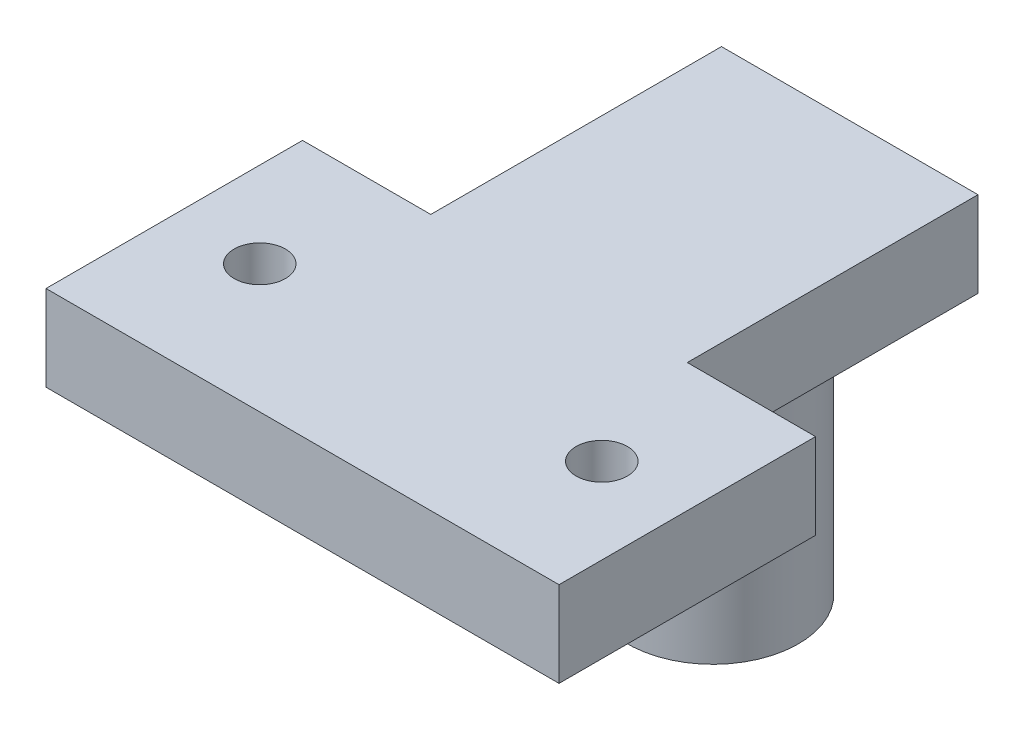
ISO-10303-21;
HEADER;
FILE_DESCRIPTION(('STEP AP214'),'2;1');
FILE_NAME('part.step','',(''),(''),'','','');
FILE_SCHEMA(('AUTOMOTIVE_DESIGN { 1 0 10303 214 1 1 1 1 }'));
ENDSEC;
DATA;
#1=APPLICATION_CONTEXT('core data for automotive mechanical design processes');
#2=APPLICATION_PROTOCOL_DEFINITION('international standard','automotive_design',2000,#1);
#3=PRODUCT_CONTEXT('',#1,'mechanical');
#4=PRODUCT('Part','Part','',(#3));
#5=PRODUCT_RELATED_PRODUCT_CATEGORY('part','',(#4));
#6=PRODUCT_DEFINITION_FORMATION('','',#4);
#7=PRODUCT_DEFINITION_CONTEXT('part definition',#1,'design');
#8=PRODUCT_DEFINITION('design','',#6,#7);
#9=PRODUCT_DEFINITION_SHAPE('','',#8);
#10=(LENGTH_UNIT() NAMED_UNIT(*) SI_UNIT(.MILLI.,.METRE.));
#11=(NAMED_UNIT(*) PLANE_ANGLE_UNIT() SI_UNIT($,.RADIAN.));
#12=(NAMED_UNIT(*) SI_UNIT($,.STERADIAN.) SOLID_ANGLE_UNIT());
#13=UNCERTAINTY_MEASURE_WITH_UNIT(LENGTH_MEASURE(1.E-05),#10,'distance_accuracy_value','');
#14=(GEOMETRIC_REPRESENTATION_CONTEXT(3) GLOBAL_UNCERTAINTY_ASSIGNED_CONTEXT((#13)) GLOBAL_UNIT_ASSIGNED_CONTEXT((#10,
#11,#12)) REPRESENTATION_CONTEXT('',''));
#15=CARTESIAN_POINT('',(0.,0.,0.));
#16=DIRECTION('',(0.,0.,1.));
#17=DIRECTION('',(1.,0.,0.));
#18=AXIS2_PLACEMENT_3D('',#15,#16,#17);
#19=CARTESIAN_POINT('',(0.,5.,0.));
#20=DIRECTION('',(0.,0.,1.));
#21=DIRECTION('',(1.,0.,0.));
#22=AXIS2_PLACEMENT_3D('',#19,#20,#21);
#23=PLANE('',#22);
#24=DIRECTION('',(-1.,0.,0.));
#25=VECTOR('',#24,1.);
#26=CARTESIAN_POINT('',(0.,0.,0.));
#27=LINE('',#26,#25);
#28=CARTESIAN_POINT('',(0.,0.,0.));
#29=VERTEX_POINT('',#28);
#30=CARTESIAN_POINT('',(-7.5,0.,0.));
#31=VERTEX_POINT('',#30);
#32=EDGE_CURVE('E156',#29,#31,#27,.T.);
#33=ORIENTED_EDGE('',*,*,#32,.T.);
#34=DIRECTION('',(0.,-1.,0.));
#35=VECTOR('',#34,1.);
#36=CARTESIAN_POINT('',(-7.5,5.,0.));
#37=LINE('',#36,#35);
#38=CARTESIAN_POINT('',(-7.5,5.,0.));
#39=VERTEX_POINT('',#38);
#40=EDGE_CURVE('E45',#39,#31,#37,.T.);
#41=ORIENTED_EDGE('',*,*,#40,.F.);
#42=DIRECTION('',(-1.,0.,0.));
#43=VECTOR('',#42,1.);
#44=CARTESIAN_POINT('',(0.,5.,0.));
#45=LINE('',#44,#43);
#46=CARTESIAN_POINT('',(0.,5.,0.));
#47=VERTEX_POINT('',#46);
#48=EDGE_CURVE('E250',#47,#39,#45,.T.);
#49=ORIENTED_EDGE('',*,*,#48,.F.);
#50=DIRECTION('',(0.,-1.,0.));
#51=VECTOR('',#50,1.);
#52=CARTESIAN_POINT('',(0.,5.,0.));
#53=LINE('',#52,#51);
#54=EDGE_CURVE('E60',#47,#29,#53,.T.);
#55=ORIENTED_EDGE('',*,*,#54,.T.);
#56=EDGE_LOOP('',(#33,#41,#49,#55));
#57=FACE_BOUND('',#56,.T.);
#58=ADVANCED_FACE('F41',(#57),#23,.F.);
#59=CARTESIAN_POINT('',(-7.5,5.,0.));
#60=DIRECTION('',(-1.,0.,0.));
#61=DIRECTION('',(0.,0.,1.));
#62=AXIS2_PLACEMENT_3D('',#59,#60,#61);
#63=PLANE('',#62);
#64=DIRECTION('',(0.,0.,-1.));
#65=VECTOR('',#64,1.);
#66=CARTESIAN_POINT('',(-7.5,0.,0.));
#67=LINE('',#66,#65);
#68=CARTESIAN_POINT('',(-7.5,0.,-17.));
#69=VERTEX_POINT('',#68);
#70=EDGE_CURVE('E159',#31,#69,#67,.T.);
#71=ORIENTED_EDGE('',*,*,#70,.T.);
#72=DIRECTION('',(0.,-1.,0.));
#73=VECTOR('',#72,1.);
#74=CARTESIAN_POINT('',(-7.5,5.,-17.));
#75=LINE('',#74,#73);
#76=CARTESIAN_POINT('',(-7.5,5.,-17.));
#77=VERTEX_POINT('',#76);
#78=EDGE_CURVE('E193',#77,#69,#75,.T.);
#79=ORIENTED_EDGE('',*,*,#78,.F.);
#80=DIRECTION('',(0.,0.,-1.));
#81=VECTOR('',#80,1.);
#82=CARTESIAN_POINT('',(-7.5,5.,0.));
#83=LINE('',#82,#81);
#84=EDGE_CURVE('E99',#39,#77,#83,.T.);
#85=ORIENTED_EDGE('',*,*,#84,.F.);
#86=ORIENTED_EDGE('',*,*,#40,.T.);
#87=EDGE_LOOP('',(#71,#79,#85,#86));
#88=FACE_BOUND('',#87,.T.);
#89=ADVANCED_FACE('F200',(#88),#63,.F.);
#90=CARTESIAN_POINT('',(0.,5.,-17.));
#91=DIRECTION('',(0.,0.,-1.));
#92=DIRECTION('',(-1.,0.,0.));
#93=AXIS2_PLACEMENT_3D('',#90,#91,#92);
#94=PLANE('',#93);
#95=DIRECTION('',(1.,0.,0.));
#96=VECTOR('',#95,1.);
#97=CARTESIAN_POINT('',(0.,0.,-17.));
#98=LINE('',#97,#96);
#99=CARTESIAN_POINT('',(-22.5,0.,-17.));
#100=VERTEX_POINT('',#99);
#101=EDGE_CURVE('E164',#100,#69,#98,.T.);
#102=ORIENTED_EDGE('',*,*,#101,.F.);
#103=DIRECTION('',(0.,-1.,0.));
#104=VECTOR('',#103,1.);
#105=CARTESIAN_POINT('',(-22.5,5.,-17.));
#106=LINE('',#105,#104);
#107=CARTESIAN_POINT('',(-22.5,5.,-17.));
#108=VERTEX_POINT('',#107);
#109=EDGE_CURVE('E191',#108,#100,#106,.T.);
#110=ORIENTED_EDGE('',*,*,#109,.F.);
#111=DIRECTION('',(1.,0.,0.));
#112=VECTOR('',#111,1.);
#113=CARTESIAN_POINT('',(0.,5.,-17.));
#114=LINE('',#113,#112);
#115=EDGE_CURVE('E255',#108,#77,#114,.T.);
#116=ORIENTED_EDGE('',*,*,#115,.T.);
#117=ORIENTED_EDGE('',*,*,#78,.T.);
#118=EDGE_LOOP('',(#102,#110,#116,#117));
#119=FACE_BOUND('',#118,.T.);
#120=ADVANCED_FACE('F222',(#119),#94,.T.);
#121=CARTESIAN_POINT('',(-22.5,5.,0.));
#122=DIRECTION('',(-1.,0.,0.));
#123=DIRECTION('',(0.,0.,1.));
#124=AXIS2_PLACEMENT_3D('',#121,#122,#123);
#125=PLANE('',#124);
#126=DIRECTION('',(0.,0.,-1.));
#127=VECTOR('',#126,1.);
#128=CARTESIAN_POINT('',(-22.5,0.,0.));
#129=LINE('',#128,#127);
#130=CARTESIAN_POINT('',(-22.5,0.,0.));
#131=VERTEX_POINT('',#130);
#132=EDGE_CURVE('E168',#131,#100,#129,.T.);
#133=ORIENTED_EDGE('',*,*,#132,.F.);
#134=DIRECTION('',(0.,-1.,0.));
#135=VECTOR('',#134,1.);
#136=CARTESIAN_POINT('',(-22.5,5.,0.));
#137=LINE('',#136,#135);
#138=CARTESIAN_POINT('',(-22.5,5.,0.));
#139=VERTEX_POINT('',#138);
#140=EDGE_CURVE('E188',#139,#131,#137,.T.);
#141=ORIENTED_EDGE('',*,*,#140,.F.);
#142=DIRECTION('',(0.,0.,-1.));
#143=VECTOR('',#142,1.);
#144=CARTESIAN_POINT('',(-22.5,5.,0.));
#145=LINE('',#144,#143);
#146=EDGE_CURVE('E257',#139,#108,#145,.T.);
#147=ORIENTED_EDGE('',*,*,#146,.T.);
#148=ORIENTED_EDGE('',*,*,#109,.T.);
#149=EDGE_LOOP('',(#133,#141,#147,#148));
#150=FACE_BOUND('',#149,.T.);
#151=ADVANCED_FACE('F227',(#150),#125,.T.);
#152=CARTESIAN_POINT('',(-30.,0.,0.));
#153=VERTEX_POINT('',#152);
#154=EDGE_CURVE('E160',#131,#153,#27,.T.);
#155=ORIENTED_EDGE('',*,*,#154,.T.);
#156=DIRECTION('',(0.,-1.,0.));
#157=VECTOR('',#156,1.);
#158=CARTESIAN_POINT('',(-30.,5.,0.));
#159=LINE('',#158,#157);
#160=CARTESIAN_POINT('',(-30.,5.,0.));
#161=VERTEX_POINT('',#160);
#162=EDGE_CURVE('E137',#161,#153,#159,.T.);
#163=ORIENTED_EDGE('',*,*,#162,.F.);
#164=EDGE_CURVE('E123',#139,#161,#45,.T.);
#165=ORIENTED_EDGE('',*,*,#164,.F.);
#166=ORIENTED_EDGE('',*,*,#140,.T.);
#167=EDGE_LOOP('',(#155,#163,#165,#166));
#168=FACE_BOUND('',#167,.T.);
#169=ADVANCED_FACE('F218',(#168),#23,.F.);
#170=CARTESIAN_POINT('',(-30.,5.,0.));
#171=DIRECTION('',(1.,0.,0.));
#172=DIRECTION('',(0.,0.,-1.));
#173=AXIS2_PLACEMENT_3D('',#170,#171,#172);
#174=PLANE('',#173);
#175=DIRECTION('',(0.,0.,1.));
#176=VECTOR('',#175,1.);
#177=CARTESIAN_POINT('',(-30.,0.,0.));
#178=LINE('',#177,#176);
#179=CARTESIAN_POINT('',(-30.,0.,15.));
#180=VERTEX_POINT('',#179);
#181=EDGE_CURVE('E133',#153,#180,#178,.T.);
#182=ORIENTED_EDGE('',*,*,#181,.T.);
#183=DIRECTION('',(0.,-1.,0.));
#184=VECTOR('',#183,1.);
#185=CARTESIAN_POINT('',(-30.,5.,15.));
#186=LINE('',#185,#184);
#187=CARTESIAN_POINT('',(-30.,5.,15.));
#188=VERTEX_POINT('',#187);
#189=EDGE_CURVE('E130',#188,#180,#186,.T.);
#190=ORIENTED_EDGE('',*,*,#189,.F.);
#191=DIRECTION('',(0.,0.,1.));
#192=VECTOR('',#191,1.);
#193=CARTESIAN_POINT('',(-30.,5.,0.));
#194=LINE('',#193,#192);
#195=EDGE_CURVE('E115',#161,#188,#194,.T.);
#196=ORIENTED_EDGE('',*,*,#195,.F.);
#197=ORIENTED_EDGE('',*,*,#162,.T.);
#198=EDGE_LOOP('',(#182,#190,#196,#197));
#199=FACE_BOUND('',#198,.T.);
#200=ADVANCED_FACE('F131',(#199),#174,.F.);
#201=CARTESIAN_POINT('',(0.,5.,15.));
#202=DIRECTION('',(0.,0.,1.));
#203=DIRECTION('',(1.,0.,0.));
#204=AXIS2_PLACEMENT_3D('',#201,#202,#203);
#205=PLANE('',#204);
#206=DIRECTION('',(-1.,0.,0.));
#207=VECTOR('',#206,1.);
#208=CARTESIAN_POINT('',(0.,0.,15.));
#209=LINE('',#208,#207);
#210=CARTESIAN_POINT('',(0.,0.,15.));
#211=VERTEX_POINT('',#210);
#212=EDGE_CURVE('E174',#211,#180,#209,.T.);
#213=ORIENTED_EDGE('',*,*,#212,.F.);
#214=DIRECTION('',(0.,-1.,0.));
#215=VECTOR('',#214,1.);
#216=CARTESIAN_POINT('',(0.,5.,15.));
#217=LINE('',#216,#215);
#218=CARTESIAN_POINT('',(0.,5.,15.));
#219=VERTEX_POINT('',#218);
#220=EDGE_CURVE('E86',#219,#211,#217,.T.);
#221=ORIENTED_EDGE('',*,*,#220,.F.);
#222=DIRECTION('',(-1.,0.,0.));
#223=VECTOR('',#222,1.);
#224=CARTESIAN_POINT('',(0.,5.,15.));
#225=LINE('',#224,#223);
#226=EDGE_CURVE('E120',#219,#188,#225,.T.);
#227=ORIENTED_EDGE('',*,*,#226,.T.);
#228=ORIENTED_EDGE('',*,*,#189,.T.);
#229=EDGE_LOOP('',(#213,#221,#227,#228));
#230=FACE_BOUND('',#229,.T.);
#231=ADVANCED_FACE('F139',(#230),#205,.T.);
#232=CARTESIAN_POINT('',(-25.,5.,7.5));
#233=DIRECTION('',(0.,-1.,0.));
#234=DIRECTION('',(0.,0.,-1.));
#235=AXIS2_PLACEMENT_3D('',#232,#233,#234);
#236=CYLINDRICAL_SURFACE('',#235,1.5);
#237=CARTESIAN_POINT('',(-25.,5.,7.5));
#238=DIRECTION('',(0.,1.,0.));
#239=DIRECTION('',(0.,0.,1.));
#240=AXIS2_PLACEMENT_3D('',#237,#238,#239);
#241=CIRCLE('',#240,1.5);
#242=CARTESIAN_POINT('',(-25.,5.,9.00000000000001));
#243=VERTEX_POINT('',#242);
#244=EDGE_CURVE('E246',#243,#243,#241,.T.);
#245=ORIENTED_EDGE('',*,*,#244,.T.);
#246=EDGE_LOOP('',(#245));
#247=FACE_BOUND('',#246,.T.);
#248=CARTESIAN_POINT('',(-25.,0.,7.5));
#249=DIRECTION('',(0.,1.,0.));
#250=DIRECTION('',(0.,0.,1.));
#251=AXIS2_PLACEMENT_3D('',#248,#249,#250);
#252=CIRCLE('',#251,1.5);
#253=CARTESIAN_POINT('',(-25.,0.,9.00000000000001));
#254=VERTEX_POINT('',#253);
#255=EDGE_CURVE('E151',#254,#254,#252,.T.);
#256=ORIENTED_EDGE('',*,*,#255,.F.);
#257=EDGE_LOOP('',(#256));
#258=FACE_BOUND('',#257,.T.);
#259=ADVANCED_FACE('F212',(#247,#258),#236,.F.);
#260=CARTESIAN_POINT('',(-5.,5.,7.5));
#261=DIRECTION('',(0.,-1.,0.));
#262=DIRECTION('',(0.,0.,-1.));
#263=AXIS2_PLACEMENT_3D('',#260,#261,#262);
#264=CYLINDRICAL_SURFACE('',#263,1.5);
#265=CARTESIAN_POINT('',(-5.,5.,7.5));
#266=DIRECTION('',(0.,1.,0.));
#267=DIRECTION('',(0.,0.,1.));
#268=AXIS2_PLACEMENT_3D('',#265,#266,#267);
#269=CIRCLE('',#268,1.5);
#270=CARTESIAN_POINT('',(-5.,5.,9.));
#271=VERTEX_POINT('',#270);
#272=EDGE_CURVE('E181',#271,#271,#269,.T.);
#273=ORIENTED_EDGE('',*,*,#272,.T.);
#274=EDGE_LOOP('',(#273));
#275=FACE_BOUND('',#274,.T.);
#276=CARTESIAN_POINT('',(-5.,0.,7.5));
#277=DIRECTION('',(0.,1.,0.));
#278=DIRECTION('',(0.,0.,1.));
#279=AXIS2_PLACEMENT_3D('',#276,#277,#278);
#280=CIRCLE('',#279,1.5);
#281=CARTESIAN_POINT('',(-5.,0.,9.));
#282=VERTEX_POINT('',#281);
#283=EDGE_CURVE('E147',#282,#282,#280,.T.);
#284=ORIENTED_EDGE('',*,*,#283,.F.);
#285=EDGE_LOOP('',(#284));
#286=FACE_BOUND('',#285,.T.);
#287=ADVANCED_FACE('F43',(#275,#286),#264,.F.);
#288=CARTESIAN_POINT('',(0.,5.,0.));
#289=DIRECTION('',(1.,0.,0.));
#290=DIRECTION('',(0.,0.,-1.));
#291=AXIS2_PLACEMENT_3D('',#288,#289,#290);
#292=PLANE('',#291);
#293=DIRECTION('',(0.,0.,1.));
#294=VECTOR('',#293,1.);
#295=CARTESIAN_POINT('',(0.,0.,0.));
#296=LINE('',#295,#294);
#297=EDGE_CURVE('E177',#29,#211,#296,.T.);
#298=ORIENTED_EDGE('',*,*,#297,.F.);
#299=ORIENTED_EDGE('',*,*,#54,.F.);
#300=DIRECTION('',(0.,0.,1.));
#301=VECTOR('',#300,1.);
#302=CARTESIAN_POINT('',(0.,5.,0.));
#303=LINE('',#302,#301);
#304=EDGE_CURVE('E141',#47,#219,#303,.T.);
#305=ORIENTED_EDGE('',*,*,#304,.T.);
#306=ORIENTED_EDGE('',*,*,#220,.T.);
#307=EDGE_LOOP('',(#298,#299,#305,#306));
#308=FACE_BOUND('',#307,.T.);
#309=ADVANCED_FACE('F203',(#308),#292,.T.);
#310=CARTESIAN_POINT('',(0.,5.,0.));
#311=DIRECTION('',(0.,1.,0.));
#312=DIRECTION('',(0.,0.,1.));
#313=AXIS2_PLACEMENT_3D('',#310,#311,#312);
#314=PLANE('',#313);
#315=ORIENTED_EDGE('',*,*,#272,.F.);
#316=EDGE_LOOP('',(#315));
#317=FACE_BOUND('',#316,.T.);
#318=ORIENTED_EDGE('',*,*,#244,.F.);
#319=EDGE_LOOP('',(#318));
#320=FACE_BOUND('',#319,.T.);
#321=ORIENTED_EDGE('',*,*,#48,.T.);
#322=ORIENTED_EDGE('',*,*,#84,.T.);
#323=ORIENTED_EDGE('',*,*,#115,.F.);
#324=ORIENTED_EDGE('',*,*,#146,.F.);
#325=ORIENTED_EDGE('',*,*,#164,.T.);
#326=ORIENTED_EDGE('',*,*,#195,.T.);
#327=ORIENTED_EDGE('',*,*,#226,.F.);
#328=ORIENTED_EDGE('',*,*,#304,.F.);
#329=EDGE_LOOP('',(#321,#322,#323,#324,#325,#326,#327,#328));
#330=FACE_BOUND('',#329,.T.);
#331=ADVANCED_FACE('F117',(#317,#320,#330),#314,.T.);
#332=CARTESIAN_POINT('',(0.,0.,0.));
#333=DIRECTION('',(0.,1.,0.));
#334=DIRECTION('',(0.,0.,1.));
#335=AXIS2_PLACEMENT_3D('',#332,#333,#334);
#336=PLANE('',#335);
#337=CARTESIAN_POINT('',(-15.,0.,-9.));
#338=DIRECTION('',(0.,-1.,0.));
#339=DIRECTION('',(0.,0.,-1.));
#340=AXIS2_PLACEMENT_3D('',#337,#338,#339);
#341=CIRCLE('',#340,5.);
#342=CARTESIAN_POINT('',(-15.,0.,-14.));
#343=VERTEX_POINT('',#342);
#344=EDGE_CURVE('E11',#343,#343,#341,.T.);
#345=ORIENTED_EDGE('',*,*,#344,.F.);
#346=EDGE_LOOP('',(#345));
#347=FACE_BOUND('',#346,.T.);
#348=ORIENTED_EDGE('',*,*,#283,.T.);
#349=EDGE_LOOP('',(#348));
#350=FACE_BOUND('',#349,.T.);
#351=ORIENTED_EDGE('',*,*,#255,.T.);
#352=EDGE_LOOP('',(#351));
#353=FACE_BOUND('',#352,.T.);
#354=ORIENTED_EDGE('',*,*,#32,.F.);
#355=ORIENTED_EDGE('',*,*,#297,.T.);
#356=ORIENTED_EDGE('',*,*,#212,.T.);
#357=ORIENTED_EDGE('',*,*,#181,.F.);
#358=ORIENTED_EDGE('',*,*,#154,.F.);
#359=ORIENTED_EDGE('',*,*,#132,.T.);
#360=ORIENTED_EDGE('',*,*,#101,.T.);
#361=ORIENTED_EDGE('',*,*,#70,.F.);
#362=EDGE_LOOP('',(#354,#355,#356,#357,#358,#359,#360,#361));
#363=FACE_BOUND('',#362,.T.);
#364=ADVANCED_FACE('F202',(#347,#350,#353,#363),#336,.F.);
#365=CARTESIAN_POINT('',(-15.,-15.,-9.));
#366=DIRECTION('',(0.,1.,0.));
#367=DIRECTION('',(0.,0.,1.));
#368=AXIS2_PLACEMENT_3D('',#365,#366,#367);
#369=CYLINDRICAL_SURFACE('',#368,5.);
#370=CARTESIAN_POINT('',(-15.,-15.,-9.));
#371=DIRECTION('',(0.,-1.,0.));
#372=DIRECTION('',(0.,0.,-1.));
#373=AXIS2_PLACEMENT_3D('',#370,#371,#372);
#374=CIRCLE('',#373,5.);
#375=CARTESIAN_POINT('',(-15.,-15.,-14.));
#376=VERTEX_POINT('',#375);
#377=EDGE_CURVE('E152',#376,#376,#374,.T.);
#378=ORIENTED_EDGE('',*,*,#377,.F.);
#379=EDGE_LOOP('',(#378));
#380=FACE_BOUND('',#379,.T.);
#381=ORIENTED_EDGE('',*,*,#344,.T.);
#382=EDGE_LOOP('',(#381));
#383=FACE_BOUND('',#382,.T.);
#384=ADVANCED_FACE('F276',(#380,#383),#369,.T.);
#385=CARTESIAN_POINT('',(-15.,-15.,-9.));
#386=DIRECTION('',(0.,-1.,0.));
#387=DIRECTION('',(0.,0.,-1.));
#388=AXIS2_PLACEMENT_3D('',#385,#386,#387);
#389=PLANE('',#388);
#390=ORIENTED_EDGE('',*,*,#377,.T.);
#391=EDGE_LOOP('',(#390));
#392=FACE_BOUND('',#391,.T.);
#393=ADVANCED_FACE('F281',(#392),#389,.T.);
#394=CLOSED_SHELL('',(#58,#89,#120,#151,#169,#200,#231,#259,#287,#309,#331,#364,#384,#393));
#395=MANIFOLD_SOLID_BREP('B2',#394);
#396=ADVANCED_BREP_SHAPE_REPRESENTATION('',(#18,#395),#14);
#397=SHAPE_DEFINITION_REPRESENTATION(#9,#396);
ENDSEC;
END-ISO-10303-21;
